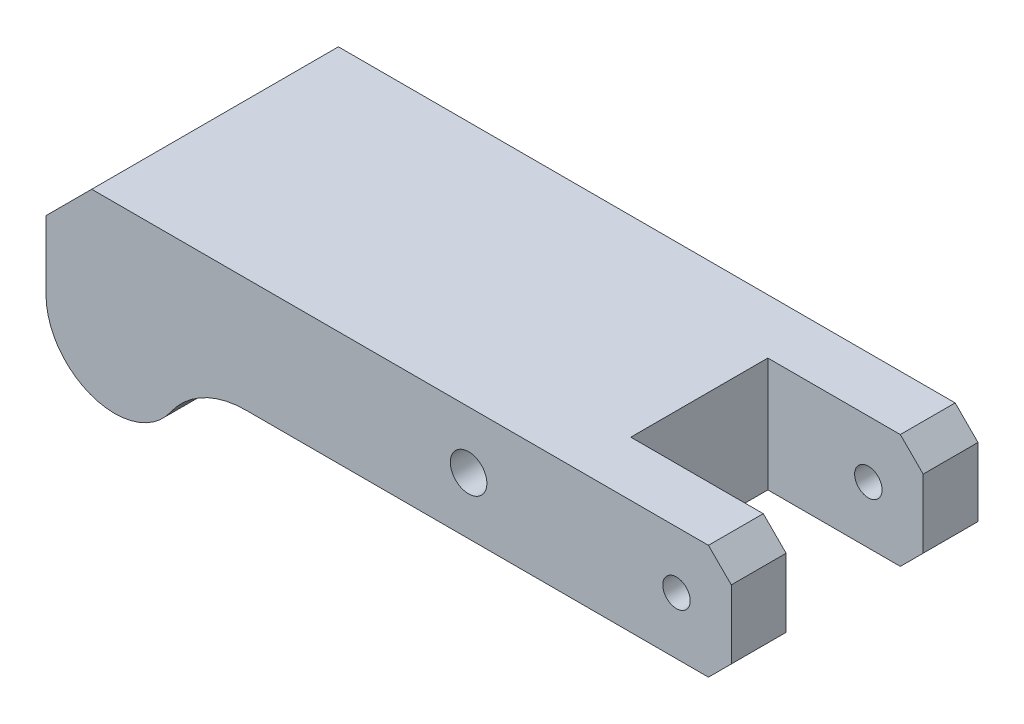
ISO-10303-21;
HEADER;
FILE_DESCRIPTION(('STEP AP214'),'2;1');
FILE_NAME('part.step','',(''),(''),'','','');
FILE_SCHEMA(('AUTOMOTIVE_DESIGN { 1 0 10303 214 1 1 1 1 }'));
ENDSEC;
DATA;
#1=APPLICATION_CONTEXT('core data for automotive mechanical design processes');
#2=APPLICATION_PROTOCOL_DEFINITION('international standard','automotive_design',2000,#1);
#3=PRODUCT_CONTEXT('',#1,'mechanical');
#4=PRODUCT('Part','Part','',(#3));
#5=PRODUCT_RELATED_PRODUCT_CATEGORY('part','',(#4));
#6=PRODUCT_DEFINITION_FORMATION('','',#4);
#7=PRODUCT_DEFINITION_CONTEXT('part definition',#1,'design');
#8=PRODUCT_DEFINITION('design','',#6,#7);
#9=PRODUCT_DEFINITION_SHAPE('','',#8);
#10=(LENGTH_UNIT() NAMED_UNIT(*) SI_UNIT(.MILLI.,.METRE.));
#11=(NAMED_UNIT(*) PLANE_ANGLE_UNIT() SI_UNIT($,.RADIAN.));
#12=(NAMED_UNIT(*) SI_UNIT($,.STERADIAN.) SOLID_ANGLE_UNIT());
#13=UNCERTAINTY_MEASURE_WITH_UNIT(LENGTH_MEASURE(1.E-05),#10,'distance_accuracy_value','');
#14=(GEOMETRIC_REPRESENTATION_CONTEXT(3) GLOBAL_UNCERTAINTY_ASSIGNED_CONTEXT((#13)) GLOBAL_UNIT_ASSIGNED_CONTEXT((#10,
#11,#12)) REPRESENTATION_CONTEXT('',''));
#15=CARTESIAN_POINT('',(0.,0.,0.));
#16=DIRECTION('',(0.,0.,1.));
#17=DIRECTION('',(1.,0.,0.));
#18=AXIS2_PLACEMENT_3D('',#15,#16,#17);
#19=CARTESIAN_POINT('',(0.,0.,27.));
#20=DIRECTION('',(-1.,0.,0.));
#21=DIRECTION('',(0.,0.,1.));
#22=AXIS2_PLACEMENT_3D('',#19,#20,#21);
#23=PLANE('',#22);
#24=DIRECTION('',(0.,0.,-1.));
#25=VECTOR('',#24,1.);
#26=CARTESIAN_POINT('',(0.,5.00000000000002,27.));
#27=LINE('',#26,#25);
#28=CARTESIAN_POINT('',(0.,5.00000000000002,27.));
#29=VERTEX_POINT('',#28);
#30=CARTESIAN_POINT('',(0.,5.00000000000002,15.));
#31=VERTEX_POINT('',#30);
#32=EDGE_CURVE('E255',#29,#31,#27,.T.);
#33=ORIENTED_EDGE('',*,*,#32,.T.);
#34=DIRECTION('',(0.,1.,0.));
#35=VECTOR('',#34,1.);
#36=CARTESIAN_POINT('',(0.,0.,15.));
#37=LINE('',#36,#35);
#38=CARTESIAN_POINT('',(0.,20.,15.));
#39=VERTEX_POINT('',#38);
#40=EDGE_CURVE('E180',#31,#39,#37,.T.);
#41=ORIENTED_EDGE('',*,*,#40,.T.);
#42=DIRECTION('',(0.,0.,1.));
#43=VECTOR('',#42,1.);
#44=CARTESIAN_POINT('',(0.,20.,27.));
#45=LINE('',#44,#43);
#46=CARTESIAN_POINT('',(0.,20.,27.));
#47=VERTEX_POINT('',#46);
#48=EDGE_CURVE('E250',#39,#47,#45,.T.);
#49=ORIENTED_EDGE('',*,*,#48,.T.);
#50=DIRECTION('',(0.,1.,0.));
#51=VECTOR('',#50,1.);
#52=CARTESIAN_POINT('',(0.,0.,27.));
#53=LINE('',#52,#51);
#54=EDGE_CURVE('E204',#29,#47,#53,.T.);
#55=ORIENTED_EDGE('',*,*,#54,.F.);
#56=EDGE_LOOP('',(#33,#41,#49,#55));
#57=FACE_BOUND('',#56,.T.);
#58=ADVANCED_FACE('F39',(#57),#23,.F.);
#59=CARTESIAN_POINT('',(-12.,12.5,27.));
#60=DIRECTION('',(0.,0.,-1.));
#61=DIRECTION('',(-1.,0.,0.));
#62=AXIS2_PLACEMENT_3D('',#59,#60,#61);
#63=CYLINDRICAL_SURFACE('',#62,3.);
#64=CARTESIAN_POINT('',(-12.,12.5,15.));
#65=DIRECTION('',(0.,0.,1.));
#66=DIRECTION('',(1.,0.,0.));
#67=AXIS2_PLACEMENT_3D('',#64,#65,#66);
#68=CIRCLE('',#67,3.);
#69=CARTESIAN_POINT('',(-9.,12.5,15.));
#70=VERTEX_POINT('',#69);
#71=EDGE_CURVE('E188',#70,#70,#68,.T.);
#72=ORIENTED_EDGE('',*,*,#71,.F.);
#73=EDGE_LOOP('',(#72));
#74=FACE_BOUND('',#73,.T.);
#75=CARTESIAN_POINT('',(-12.,12.5,27.));
#76=DIRECTION('',(0.,0.,1.));
#77=DIRECTION('',(1.,0.,0.));
#78=AXIS2_PLACEMENT_3D('',#75,#76,#77);
#79=CIRCLE('',#78,3.);
#80=CARTESIAN_POINT('',(-9.,12.5,27.));
#81=VERTEX_POINT('',#80);
#82=EDGE_CURVE('E198',#81,#81,#79,.T.);
#83=ORIENTED_EDGE('',*,*,#82,.T.);
#84=EDGE_LOOP('',(#83));
#85=FACE_BOUND('',#84,.T.);
#86=ADVANCED_FACE('F337',(#74,#85),#63,.F.);
#87=CARTESIAN_POINT('',(0.,5.00000000000002,27.));
#88=DIRECTION('',(-0.707106781186546,0.707106781186548,0.));
#89=DIRECTION('',(0.,0.,-1.));
#90=AXIS2_PLACEMENT_3D('',#87,#88,#89);
#91=PLANE('',#90);
#92=DIRECTION('',(0.707106781186549,0.707106781186547,0.));
#93=VECTOR('',#92,1.);
#94=CARTESIAN_POINT('',(0.,5.00000000000002,15.));
#95=LINE('',#94,#93);
#96=CARTESIAN_POINT('',(-5.00000000000003,0.,15.));
#97=VERTEX_POINT('',#96);
#98=EDGE_CURVE('E183',#31,#97,#95,.F.);
#99=ORIENTED_EDGE('',*,*,#98,.F.);
#100=ORIENTED_EDGE('',*,*,#32,.F.);
#101=DIRECTION('',(-0.707106781186549,-0.707106781186547,0.));
#102=VECTOR('',#101,1.);
#103=CARTESIAN_POINT('',(-70.0000000000002,-65.,27.));
#104=LINE('',#103,#102);
#105=CARTESIAN_POINT('',(-5.00000000000003,0.,27.));
#106=VERTEX_POINT('',#105);
#107=EDGE_CURVE('E267',#106,#29,#104,.F.);
#108=ORIENTED_EDGE('',*,*,#107,.F.);
#109=DIRECTION('',(0.,0.,1.));
#110=VECTOR('',#109,1.);
#111=CARTESIAN_POINT('',(-5.00000000000003,0.,27.));
#112=LINE('',#111,#110);
#113=EDGE_CURVE('E262',#97,#106,#112,.T.);
#114=ORIENTED_EDGE('',*,*,#113,.F.);
#115=EDGE_LOOP('',(#99,#100,#108,#114));
#116=FACE_BOUND('',#115,.T.);
#117=ADVANCED_FACE('F317',(#116),#91,.F.);
#118=CARTESIAN_POINT('',(-5.00000000000002,25.,27.));
#119=DIRECTION('',(-0.707106781186548,-0.707106781186546,0.));
#120=DIRECTION('',(0.,0.,-1.));
#121=AXIS2_PLACEMENT_3D('',#118,#119,#120);
#122=PLANE('',#121);
#123=DIRECTION('',(-0.707106781186547,0.707106781186549,0.));
#124=VECTOR('',#123,1.);
#125=CARTESIAN_POINT('',(-5.00000000000002,25.,15.));
#126=LINE('',#125,#124);
#127=CARTESIAN_POINT('',(-5.00000000000002,25.,15.));
#128=VERTEX_POINT('',#127);
#129=EDGE_CURVE('E48',#128,#39,#126,.F.);
#130=ORIENTED_EDGE('',*,*,#129,.F.);
#131=DIRECTION('',(0.,0.,-1.));
#132=VECTOR('',#131,1.);
#133=CARTESIAN_POINT('',(-5.00000000000002,25.,27.));
#134=LINE('',#133,#132);
#135=CARTESIAN_POINT('',(-5.00000000000002,25.,27.));
#136=VERTEX_POINT('',#135);
#137=EDGE_CURVE('E270',#136,#128,#134,.T.);
#138=ORIENTED_EDGE('',*,*,#137,.F.);
#139=DIRECTION('',(0.707106781186547,-0.707106781186549,0.));
#140=VECTOR('',#139,1.);
#141=CARTESIAN_POINT('',(-57.4999999999998,77.4999999999999,27.));
#142=LINE('',#141,#140);
#143=EDGE_CURVE('E63',#47,#136,#142,.F.);
#144=ORIENTED_EDGE('',*,*,#143,.F.);
#145=ORIENTED_EDGE('',*,*,#48,.F.);
#146=EDGE_LOOP('',(#130,#138,#144,#145));
#147=FACE_BOUND('',#146,.T.);
#148=ADVANCED_FACE('F282',(#147),#122,.F.);
#149=CARTESIAN_POINT('',(-135.,0.,27.));
#150=DIRECTION('',(0.,0.,1.));
#151=DIRECTION('',(1.,0.,0.));
#152=AXIS2_PLACEMENT_3D('',#149,#150,#151);
#153=PLANE('',#152);
#154=ORIENTED_EDGE('',*,*,#82,.F.);
#155=EDGE_LOOP('',(#154));
#156=FACE_BOUND('',#155,.T.);
#157=DIRECTION('',(1.,0.,0.));
#158=VECTOR('',#157,1.);
#159=CARTESIAN_POINT('',(0.,0.,27.));
#160=LINE('',#159,#158);
#161=CARTESIAN_POINT('',(-106.27718676731,0.,27.));
#162=VERTEX_POINT('',#161);
#163=EDGE_CURVE('E215',#162,#106,#160,.T.);
#164=ORIENTED_EDGE('',*,*,#163,.T.);
#165=ORIENTED_EDGE('',*,*,#107,.T.);
#166=ORIENTED_EDGE('',*,*,#54,.T.);
#167=ORIENTED_EDGE('',*,*,#143,.T.);
#168=DIRECTION('',(-1.,0.,0.));
#169=VECTOR('',#168,1.);
#170=CARTESIAN_POINT('',(0.,25.,27.));
#171=LINE('',#170,#169);
#172=CARTESIAN_POINT('',(-140.,25.,27.));
#173=VERTEX_POINT('',#172);
#174=EDGE_CURVE('E206',#136,#173,#171,.T.);
#175=ORIENTED_EDGE('',*,*,#174,.T.);
#176=DIRECTION('',(0.707106781186548,0.707106781186547,0.));
#177=VECTOR('',#176,1.);
#178=CARTESIAN_POINT('',(-150.,15.,27.));
#179=LINE('',#178,#177);
#180=CARTESIAN_POINT('',(-150.,15.,27.));
#181=VERTEX_POINT('',#180);
#182=EDGE_CURVE('E248',#173,#181,#179,.F.);
#183=ORIENTED_EDGE('',*,*,#182,.T.);
#184=DIRECTION('',(0.,-1.,0.));
#185=VECTOR('',#184,1.);
#186=CARTESIAN_POINT('',(-150.,0.,27.));
#187=LINE('',#186,#185);
#188=CARTESIAN_POINT('',(-150.,0.,27.));
#189=VERTEX_POINT('',#188);
#190=EDGE_CURVE('E209',#181,#189,#187,.T.);
#191=ORIENTED_EDGE('',*,*,#190,.T.);
#192=CARTESIAN_POINT('',(-135.,0.,27.));
#193=DIRECTION('',(0.,0.,1.));
#194=DIRECTION('',(1.,0.,0.));
#195=AXIS2_PLACEMENT_3D('',#192,#193,#194);
#196=CIRCLE('',#195,15.);
#197=CARTESIAN_POINT('',(-122.690222900276,-8.57142857142858,27.));
#198=VERTEX_POINT('',#197);
#199=EDGE_CURVE('E211',#189,#198,#196,.T.);
#200=ORIENTED_EDGE('',*,*,#199,.T.);
#201=CARTESIAN_POINT('',(-106.27718676731,-20.,27.));
#202=DIRECTION('',(0.,0.,-1.));
#203=DIRECTION('',(-1.,0.,0.));
#204=AXIS2_PLACEMENT_3D('',#201,#202,#203);
#205=CIRCLE('',#204,20.);
#206=EDGE_CURVE('E213',#198,#162,#205,.T.);
#207=ORIENTED_EDGE('',*,*,#206,.T.);
#208=EDGE_LOOP('',(#164,#165,#166,#167,#175,#183,#191,#200,#207));
#209=FACE_BOUND('',#208,.T.);
#210=CARTESIAN_POINT('',(-57.5,12.5,27.));
#211=DIRECTION('',(0.,0.,1.));
#212=DIRECTION('',(1.,0.,0.));
#213=AXIS2_PLACEMENT_3D('',#210,#211,#212);
#214=CIRCLE('',#213,4.00000000000001);
#215=CARTESIAN_POINT('',(-53.5,12.5,27.));
#216=VERTEX_POINT('',#215);
#217=EDGE_CURVE('E192',#216,#216,#214,.T.);
#218=ORIENTED_EDGE('',*,*,#217,.F.);
#219=EDGE_LOOP('',(#218));
#220=FACE_BOUND('',#219,.T.);
#221=ADVANCED_FACE('F285',(#156,#209,#220),#153,.T.);
#222=CARTESIAN_POINT('',(-135.,0.,-27.));
#223=DIRECTION('',(0.,0.,1.));
#224=DIRECTION('',(1.,0.,0.));
#225=AXIS2_PLACEMENT_3D('',#222,#223,#224);
#226=PLANE('',#225);
#227=DIRECTION('',(0.,1.,0.));
#228=VECTOR('',#227,1.);
#229=CARTESIAN_POINT('',(0.,0.,-27.));
#230=LINE('',#229,#228);
#231=CARTESIAN_POINT('',(0.,5.00000000000002,-27.));
#232=VERTEX_POINT('',#231);
#233=CARTESIAN_POINT('',(0.,20.,-27.));
#234=VERTEX_POINT('',#233);
#235=EDGE_CURVE('E201',#232,#234,#230,.T.);
#236=ORIENTED_EDGE('',*,*,#235,.F.);
#237=DIRECTION('',(0.707106781186549,0.707106781186547,0.));
#238=VECTOR('',#237,1.);
#239=CARTESIAN_POINT('',(0.,5.00000000000002,-27.));
#240=LINE('',#239,#238);
#241=CARTESIAN_POINT('',(-5.00000000000003,0.,-27.));
#242=VERTEX_POINT('',#241);
#243=EDGE_CURVE('E260',#232,#242,#240,.F.);
#244=ORIENTED_EDGE('',*,*,#243,.T.);
#245=DIRECTION('',(1.,0.,0.));
#246=VECTOR('',#245,1.);
#247=CARTESIAN_POINT('',(0.,0.,-27.));
#248=LINE('',#247,#246);
#249=CARTESIAN_POINT('',(-106.27718676731,0.,-27.));
#250=VERTEX_POINT('',#249);
#251=EDGE_CURVE('E207',#250,#242,#248,.T.);
#252=ORIENTED_EDGE('',*,*,#251,.F.);
#253=CARTESIAN_POINT('',(-106.27718676731,-20.,-27.));
#254=DIRECTION('',(0.,0.,-1.));
#255=DIRECTION('',(-1.,0.,0.));
#256=AXIS2_PLACEMENT_3D('',#253,#254,#255);
#257=CIRCLE('',#256,20.);
#258=CARTESIAN_POINT('',(-122.690222900276,-8.57142857142858,-27.));
#259=VERTEX_POINT('',#258);
#260=EDGE_CURVE('E227',#259,#250,#257,.T.);
#261=ORIENTED_EDGE('',*,*,#260,.F.);
#262=CARTESIAN_POINT('',(-135.,0.,-27.));
#263=DIRECTION('',(0.,0.,1.));
#264=DIRECTION('',(1.,0.,0.));
#265=AXIS2_PLACEMENT_3D('',#262,#263,#264);
#266=CIRCLE('',#265,15.);
#267=CARTESIAN_POINT('',(-150.,0.,-27.));
#268=VERTEX_POINT('',#267);
#269=EDGE_CURVE('E225',#268,#259,#266,.T.);
#270=ORIENTED_EDGE('',*,*,#269,.F.);
#271=DIRECTION('',(0.,-1.,0.));
#272=VECTOR('',#271,1.);
#273=CARTESIAN_POINT('',(-150.,0.,-27.));
#274=LINE('',#273,#272);
#275=CARTESIAN_POINT('',(-150.,15.,-27.));
#276=VERTEX_POINT('',#275);
#277=EDGE_CURVE('E223',#276,#268,#274,.T.);
#278=ORIENTED_EDGE('',*,*,#277,.F.);
#279=DIRECTION('',(-0.707106781186548,-0.707106781186547,0.));
#280=VECTOR('',#279,1.);
#281=CARTESIAN_POINT('',(-150.,15.,-27.));
#282=LINE('',#281,#280);
#283=CARTESIAN_POINT('',(-140.,25.,-27.));
#284=VERTEX_POINT('',#283);
#285=EDGE_CURVE('E242',#276,#284,#282,.F.);
#286=ORIENTED_EDGE('',*,*,#285,.T.);
#287=DIRECTION('',(-1.,0.,0.));
#288=VECTOR('',#287,1.);
#289=CARTESIAN_POINT('',(0.,25.,-27.));
#290=LINE('',#289,#288);
#291=CARTESIAN_POINT('',(-5.00000000000002,25.,-27.));
#292=VERTEX_POINT('',#291);
#293=EDGE_CURVE('E221',#292,#284,#290,.T.);
#294=ORIENTED_EDGE('',*,*,#293,.F.);
#295=DIRECTION('',(-0.707106781186547,0.707106781186549,0.));
#296=VECTOR('',#295,1.);
#297=CARTESIAN_POINT('',(-5.00000000000002,25.,-27.));
#298=LINE('',#297,#296);
#299=EDGE_CURVE('E258',#292,#234,#298,.F.);
#300=ORIENTED_EDGE('',*,*,#299,.T.);
#301=EDGE_LOOP('',(#236,#244,#252,#261,#270,#278,#286,#294,#300));
#302=FACE_BOUND('',#301,.T.);
#303=CARTESIAN_POINT('',(-12.,12.5,-27.));
#304=DIRECTION('',(0.,0.,1.));
#305=DIRECTION('',(1.,0.,0.));
#306=AXIS2_PLACEMENT_3D('',#303,#304,#305);
#307=CIRCLE('',#306,3.);
#308=CARTESIAN_POINT('',(-9.,12.5,-27.));
#309=VERTEX_POINT('',#308);
#310=EDGE_CURVE('E195',#309,#309,#307,.T.);
#311=ORIENTED_EDGE('',*,*,#310,.T.);
#312=EDGE_LOOP('',(#311));
#313=FACE_BOUND('',#312,.T.);
#314=CARTESIAN_POINT('',(-57.5,12.5,-27.));
#315=DIRECTION('',(0.,0.,1.));
#316=DIRECTION('',(1.,0.,0.));
#317=AXIS2_PLACEMENT_3D('',#314,#315,#316);
#318=CIRCLE('',#317,4.00000000000001);
#319=CARTESIAN_POINT('',(-53.5,12.5,-27.));
#320=VERTEX_POINT('',#319);
#321=EDGE_CURVE('E191',#320,#320,#318,.T.);
#322=ORIENTED_EDGE('',*,*,#321,.T.);
#323=EDGE_LOOP('',(#322));
#324=FACE_BOUND('',#323,.T.);
#325=ADVANCED_FACE('F299',(#302,#313,#324),#226,.F.);
#326=CARTESIAN_POINT('',(0.,20.,-15.));
#327=VERTEX_POINT('',#326);
#328=EDGE_CURVE('E251',#234,#327,#45,.T.);
#329=ORIENTED_EDGE('',*,*,#328,.T.);
#330=DIRECTION('',(0.,-1.,0.));
#331=VECTOR('',#330,1.);
#332=CARTESIAN_POINT('',(0.,0.,-15.));
#333=LINE('',#332,#331);
#334=CARTESIAN_POINT('',(0.,5.00000000000002,-15.));
#335=VERTEX_POINT('',#334);
#336=EDGE_CURVE('E55',#327,#335,#333,.T.);
#337=ORIENTED_EDGE('',*,*,#336,.T.);
#338=EDGE_CURVE('E254',#335,#232,#27,.T.);
#339=ORIENTED_EDGE('',*,*,#338,.T.);
#340=ORIENTED_EDGE('',*,*,#235,.T.);
#341=EDGE_LOOP('',(#329,#337,#339,#340));
#342=FACE_BOUND('',#341,.T.);
#343=ADVANCED_FACE('F325',(#342),#23,.F.);
#344=CARTESIAN_POINT('',(0.,25.,27.));
#345=DIRECTION('',(0.,-1.,0.));
#346=DIRECTION('',(1.,0.,0.));
#347=AXIS2_PLACEMENT_3D('',#344,#345,#346);
#348=PLANE('',#347);
#349=ORIENTED_EDGE('',*,*,#137,.T.);
#350=DIRECTION('',(1.,0.,0.));
#351=VECTOR('',#350,1.);
#352=CARTESIAN_POINT('',(14.3134978820462,25.,15.));
#353=LINE('',#352,#351);
#354=CARTESIAN_POINT('',(-34.,25.,15.));
#355=VERTEX_POINT('',#354);
#356=EDGE_CURVE('E157',#355,#128,#353,.T.);
#357=ORIENTED_EDGE('',*,*,#356,.F.);
#358=DIRECTION('',(0.,0.,1.));
#359=VECTOR('',#358,1.);
#360=CARTESIAN_POINT('',(-34.,25.,-15.));
#361=LINE('',#360,#359);
#362=CARTESIAN_POINT('',(-34.,25.,-15.));
#363=VERTEX_POINT('',#362);
#364=EDGE_CURVE('E153',#363,#355,#361,.T.);
#365=ORIENTED_EDGE('',*,*,#364,.F.);
#366=DIRECTION('',(-1.,0.,0.));
#367=VECTOR('',#366,1.);
#368=CARTESIAN_POINT('',(14.3134978820463,25.,-15.));
#369=LINE('',#368,#367);
#370=CARTESIAN_POINT('',(-5.00000000000002,25.,-15.));
#371=VERTEX_POINT('',#370);
#372=EDGE_CURVE('E160',#371,#363,#369,.T.);
#373=ORIENTED_EDGE('',*,*,#372,.F.);
#374=EDGE_CURVE('E269',#371,#292,#134,.T.);
#375=ORIENTED_EDGE('',*,*,#374,.T.);
#376=ORIENTED_EDGE('',*,*,#293,.T.);
#377=DIRECTION('',(0.,0.,1.));
#378=VECTOR('',#377,1.);
#379=CARTESIAN_POINT('',(-140.,25.,27.));
#380=LINE('',#379,#378);
#381=EDGE_CURVE('E245',#284,#173,#380,.T.);
#382=ORIENTED_EDGE('',*,*,#381,.T.);
#383=ORIENTED_EDGE('',*,*,#174,.F.);
#384=EDGE_LOOP('',(#349,#357,#365,#373,#375,#376,#382,#383));
#385=FACE_BOUND('',#384,.T.);
#386=ADVANCED_FACE('F167',(#385),#348,.F.);
#387=CARTESIAN_POINT('',(-150.,0.,27.));
#388=DIRECTION('',(1.,0.,0.));
#389=DIRECTION('',(0.,0.,-1.));
#390=AXIS2_PLACEMENT_3D('',#387,#388,#389);
#391=PLANE('',#390);
#392=ORIENTED_EDGE('',*,*,#190,.F.);
#393=DIRECTION('',(0.,0.,-1.));
#394=VECTOR('',#393,1.);
#395=CARTESIAN_POINT('',(-150.,15.,27.));
#396=LINE('',#395,#394);
#397=EDGE_CURVE('E239',#181,#276,#396,.T.);
#398=ORIENTED_EDGE('',*,*,#397,.T.);
#399=ORIENTED_EDGE('',*,*,#277,.T.);
#400=DIRECTION('',(0.,0.,-1.));
#401=VECTOR('',#400,1.);
#402=CARTESIAN_POINT('',(-150.,0.,27.));
#403=LINE('',#402,#401);
#404=EDGE_CURVE('E236',#189,#268,#403,.T.);
#405=ORIENTED_EDGE('',*,*,#404,.F.);
#406=EDGE_LOOP('',(#392,#398,#399,#405));
#407=FACE_BOUND('',#406,.T.);
#408=ADVANCED_FACE('F292',(#407),#391,.F.);
#409=CARTESIAN_POINT('',(-135.,0.,27.));
#410=DIRECTION('',(0.,0.,-1.));
#411=DIRECTION('',(-1.,0.,0.));
#412=AXIS2_PLACEMENT_3D('',#409,#410,#411);
#413=CYLINDRICAL_SURFACE('',#412,15.);
#414=ORIENTED_EDGE('',*,*,#269,.T.);
#415=DIRECTION('',(0.,0.,-1.));
#416=VECTOR('',#415,1.);
#417=CARTESIAN_POINT('',(-122.690222900276,-8.57142857142858,27.));
#418=LINE('',#417,#416);
#419=EDGE_CURVE('E233',#198,#259,#418,.T.);
#420=ORIENTED_EDGE('',*,*,#419,.F.);
#421=ORIENTED_EDGE('',*,*,#199,.F.);
#422=ORIENTED_EDGE('',*,*,#404,.T.);
#423=EDGE_LOOP('',(#414,#420,#421,#422));
#424=FACE_BOUND('',#423,.T.);
#425=ADVANCED_FACE('F304',(#424),#413,.T.);
#426=CARTESIAN_POINT('',(-106.27718676731,-20.,27.));
#427=DIRECTION('',(0.,0.,-1.));
#428=DIRECTION('',(-1.,0.,0.));
#429=AXIS2_PLACEMENT_3D('',#426,#427,#428);
#430=CYLINDRICAL_SURFACE('',#429,20.);
#431=ORIENTED_EDGE('',*,*,#260,.T.);
#432=DIRECTION('',(0.,0.,-1.));
#433=VECTOR('',#432,1.);
#434=CARTESIAN_POINT('',(-106.27718676731,0.,27.));
#435=LINE('',#434,#433);
#436=EDGE_CURVE('E218',#162,#250,#435,.T.);
#437=ORIENTED_EDGE('',*,*,#436,.F.);
#438=ORIENTED_EDGE('',*,*,#206,.F.);
#439=ORIENTED_EDGE('',*,*,#419,.T.);
#440=EDGE_LOOP('',(#431,#437,#438,#439));
#441=FACE_BOUND('',#440,.T.);
#442=ADVANCED_FACE('F311',(#441),#430,.F.);
#443=CARTESIAN_POINT('',(0.,0.,27.));
#444=DIRECTION('',(0.,1.,0.));
#445=DIRECTION('',(0.,0.,1.));
#446=AXIS2_PLACEMENT_3D('',#443,#444,#445);
#447=PLANE('',#446);
#448=DIRECTION('',(0.,0.,1.));
#449=VECTOR('',#448,1.);
#450=CARTESIAN_POINT('',(-34.,0.,27.));
#451=LINE('',#450,#449);
#452=CARTESIAN_POINT('',(-34.,0.,-15.));
#453=VERTEX_POINT('',#452);
#454=CARTESIAN_POINT('',(-34.,0.,15.));
#455=VERTEX_POINT('',#454);
#456=EDGE_CURVE('E11',#453,#455,#451,.T.);
#457=ORIENTED_EDGE('',*,*,#456,.T.);
#458=DIRECTION('',(1.,0.,0.));
#459=VECTOR('',#458,1.);
#460=CARTESIAN_POINT('',(0.,0.,15.));
#461=LINE('',#460,#459);
#462=EDGE_CURVE('E185',#455,#97,#461,.T.);
#463=ORIENTED_EDGE('',*,*,#462,.T.);
#464=ORIENTED_EDGE('',*,*,#113,.T.);
#465=ORIENTED_EDGE('',*,*,#163,.F.);
#466=ORIENTED_EDGE('',*,*,#436,.T.);
#467=ORIENTED_EDGE('',*,*,#251,.T.);
#468=CARTESIAN_POINT('',(-5.00000000000003,0.,-15.));
#469=VERTEX_POINT('',#468);
#470=EDGE_CURVE('E263',#242,#469,#112,.T.);
#471=ORIENTED_EDGE('',*,*,#470,.T.);
#472=DIRECTION('',(-1.,0.,0.));
#473=VECTOR('',#472,1.);
#474=CARTESIAN_POINT('',(0.,0.,-15.));
#475=LINE('',#474,#473);
#476=EDGE_CURVE('E175',#469,#453,#475,.T.);
#477=ORIENTED_EDGE('',*,*,#476,.T.);
#478=EDGE_LOOP('',(#457,#463,#464,#465,#466,#467,#471,#477));
#479=FACE_BOUND('',#478,.T.);
#480=ADVANCED_FACE('F314',(#479),#447,.F.);
#481=CARTESIAN_POINT('',(-12.,12.5,-15.));
#482=DIRECTION('',(0.,0.,-1.));
#483=DIRECTION('',(-1.,0.,0.));
#484=AXIS2_PLACEMENT_3D('',#481,#482,#483);
#485=CIRCLE('',#484,3.);
#486=CARTESIAN_POINT('',(-15.,12.5,-15.));
#487=VERTEX_POINT('',#486);
#488=EDGE_CURVE('E177',#487,#487,#485,.T.);
#489=ORIENTED_EDGE('',*,*,#488,.F.);
#490=EDGE_LOOP('',(#489));
#491=FACE_BOUND('',#490,.T.);
#492=ORIENTED_EDGE('',*,*,#310,.F.);
#493=EDGE_LOOP('',(#492));
#494=FACE_BOUND('',#493,.T.);
#495=ADVANCED_FACE('F344',(#491,#494),#63,.F.);
#496=CARTESIAN_POINT('',(-57.5,12.5,27.));
#497=DIRECTION('',(0.,0.,-1.));
#498=DIRECTION('',(-1.,0.,0.));
#499=AXIS2_PLACEMENT_3D('',#496,#497,#498);
#500=CYLINDRICAL_SURFACE('',#499,4.00000000000001);
#501=ORIENTED_EDGE('',*,*,#217,.T.);
#502=EDGE_LOOP('',(#501));
#503=FACE_BOUND('',#502,.T.);
#504=ORIENTED_EDGE('',*,*,#321,.F.);
#505=EDGE_LOOP('',(#504));
#506=FACE_BOUND('',#505,.T.);
#507=ADVANCED_FACE('F390',(#503,#506),#500,.F.);
#508=CARTESIAN_POINT('',(-150.,15.,27.));
#509=DIRECTION('',(0.707106781186547,-0.707106781186548,0.));
#510=DIRECTION('',(0.,0.,-1.));
#511=AXIS2_PLACEMENT_3D('',#508,#509,#510);
#512=PLANE('',#511);
#513=ORIENTED_EDGE('',*,*,#182,.F.);
#514=ORIENTED_EDGE('',*,*,#381,.F.);
#515=ORIENTED_EDGE('',*,*,#285,.F.);
#516=ORIENTED_EDGE('',*,*,#397,.F.);
#517=EDGE_LOOP('',(#513,#514,#515,#516));
#518=FACE_BOUND('',#517,.T.);
#519=ADVANCED_FACE('F295',(#518),#512,.F.);
#520=DIRECTION('',(-0.707106781186549,-0.707106781186547,0.));
#521=VECTOR('',#520,1.);
#522=CARTESIAN_POINT('',(0.,5.00000000000002,-15.));
#523=LINE('',#522,#521);
#524=EDGE_CURVE('E173',#469,#335,#523,.F.);
#525=ORIENTED_EDGE('',*,*,#524,.F.);
#526=ORIENTED_EDGE('',*,*,#470,.F.);
#527=ORIENTED_EDGE('',*,*,#243,.F.);
#528=ORIENTED_EDGE('',*,*,#338,.F.);
#529=EDGE_LOOP('',(#525,#526,#527,#528));
#530=FACE_BOUND('',#529,.T.);
#531=ADVANCED_FACE('F322',(#530),#91,.F.);
#532=DIRECTION('',(0.707106781186547,-0.707106781186549,0.));
#533=VECTOR('',#532,1.);
#534=CARTESIAN_POINT('',(-5.00000000000002,25.,-15.));
#535=LINE('',#534,#533);
#536=EDGE_CURVE('E162',#327,#371,#535,.F.);
#537=ORIENTED_EDGE('',*,*,#536,.F.);
#538=ORIENTED_EDGE('',*,*,#328,.F.);
#539=ORIENTED_EDGE('',*,*,#299,.F.);
#540=ORIENTED_EDGE('',*,*,#374,.F.);
#541=EDGE_LOOP('',(#537,#538,#539,#540));
#542=FACE_BOUND('',#541,.T.);
#543=ADVANCED_FACE('F42',(#542),#122,.F.);
#544=CARTESIAN_POINT('',(-34.,-15.,-15.));
#545=DIRECTION('',(-1.,0.,0.));
#546=DIRECTION('',(0.,0.,1.));
#547=AXIS2_PLACEMENT_3D('',#544,#545,#546);
#548=PLANE('',#547);
#549=DIRECTION('',(0.,1.,0.));
#550=VECTOR('',#549,1.);
#551=CARTESIAN_POINT('',(-34.,-15.,-15.));
#552=LINE('',#551,#550);
#553=EDGE_CURVE('E148',#453,#363,#552,.T.);
#554=ORIENTED_EDGE('',*,*,#553,.T.);
#555=ORIENTED_EDGE('',*,*,#364,.T.);
#556=DIRECTION('',(0.,1.,0.));
#557=VECTOR('',#556,1.);
#558=CARTESIAN_POINT('',(-34.,-15.,15.));
#559=LINE('',#558,#557);
#560=EDGE_CURVE('E156',#455,#355,#559,.T.);
#561=ORIENTED_EDGE('',*,*,#560,.F.);
#562=ORIENTED_EDGE('',*,*,#456,.F.);
#563=EDGE_LOOP('',(#554,#555,#561,#562));
#564=FACE_BOUND('',#563,.T.);
#565=ADVANCED_FACE('F150',(#564),#548,.F.);
#566=CARTESIAN_POINT('',(14.3134978820463,-15.,15.));
#567=DIRECTION('',(0.,0.,1.));
#568=DIRECTION('',(1.,0.,0.));
#569=AXIS2_PLACEMENT_3D('',#566,#567,#568);
#570=PLANE('',#569);
#571=ORIENTED_EDGE('',*,*,#71,.T.);
#572=EDGE_LOOP('',(#571));
#573=FACE_BOUND('',#572,.T.);
#574=ORIENTED_EDGE('',*,*,#560,.T.);
#575=ORIENTED_EDGE('',*,*,#356,.T.);
#576=ORIENTED_EDGE('',*,*,#129,.T.);
#577=ORIENTED_EDGE('',*,*,#40,.F.);
#578=ORIENTED_EDGE('',*,*,#98,.T.);
#579=ORIENTED_EDGE('',*,*,#462,.F.);
#580=EDGE_LOOP('',(#574,#575,#576,#577,#578,#579));
#581=FACE_BOUND('',#580,.T.);
#582=ADVANCED_FACE('F274',(#573,#581),#570,.F.);
#583=CARTESIAN_POINT('',(14.3134978820463,-15.,-15.));
#584=DIRECTION('',(0.,0.,-1.));
#585=DIRECTION('',(-1.,0.,0.));
#586=AXIS2_PLACEMENT_3D('',#583,#584,#585);
#587=PLANE('',#586);
#588=ORIENTED_EDGE('',*,*,#488,.T.);
#589=EDGE_LOOP('',(#588));
#590=FACE_BOUND('',#589,.T.);
#591=ORIENTED_EDGE('',*,*,#524,.T.);
#592=ORIENTED_EDGE('',*,*,#336,.F.);
#593=ORIENTED_EDGE('',*,*,#536,.T.);
#594=ORIENTED_EDGE('',*,*,#372,.T.);
#595=ORIENTED_EDGE('',*,*,#553,.F.);
#596=ORIENTED_EDGE('',*,*,#476,.F.);
#597=EDGE_LOOP('',(#591,#592,#593,#594,#595,#596));
#598=FACE_BOUND('',#597,.T.);
#599=ADVANCED_FACE('F161',(#590,#598),#587,.F.);
#600=CLOSED_SHELL('',(#58,#86,#117,#148,#221,#325,#343,#386,#408,#425,#442,#480,#495,#507,#519,
#531,#543,#565,#582,#599));
#601=MANIFOLD_SOLID_BREP('B2',#600);
#602=ADVANCED_BREP_SHAPE_REPRESENTATION('',(#18,#601),#14);
#603=SHAPE_DEFINITION_REPRESENTATION(#9,#602);
ENDSEC;
END-ISO-10303-21;
